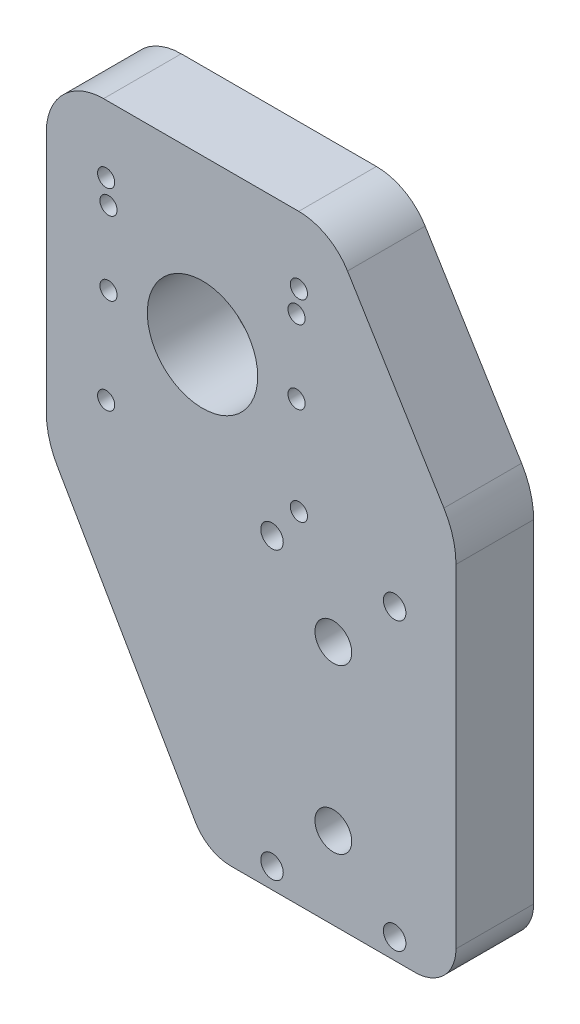
ISO-10303-21;
HEADER;
FILE_DESCRIPTION(('STEP AP214'),'2;1');
FILE_NAME('part.step','',(''),(''),'','','');
FILE_SCHEMA(('AUTOMOTIVE_DESIGN { 1 0 10303 214 1 1 1 1 }'));
ENDSEC;
DATA;
#1=APPLICATION_CONTEXT('core data for automotive mechanical design processes');
#2=APPLICATION_PROTOCOL_DEFINITION('international standard','automotive_design',2000,#1);
#3=PRODUCT_CONTEXT('',#1,'mechanical');
#4=PRODUCT('Part','Part','',(#3));
#5=PRODUCT_RELATED_PRODUCT_CATEGORY('part','',(#4));
#6=PRODUCT_DEFINITION_FORMATION('','',#4);
#7=PRODUCT_DEFINITION_CONTEXT('part definition',#1,'design');
#8=PRODUCT_DEFINITION('design','',#6,#7);
#9=PRODUCT_DEFINITION_SHAPE('','',#8);
#10=(LENGTH_UNIT() NAMED_UNIT(*) SI_UNIT(.MILLI.,.METRE.));
#11=(NAMED_UNIT(*) PLANE_ANGLE_UNIT() SI_UNIT($,.RADIAN.));
#12=(NAMED_UNIT(*) SI_UNIT($,.STERADIAN.) SOLID_ANGLE_UNIT());
#13=UNCERTAINTY_MEASURE_WITH_UNIT(LENGTH_MEASURE(1.E-05),#10,'distance_accuracy_value','');
#14=(GEOMETRIC_REPRESENTATION_CONTEXT(3) GLOBAL_UNCERTAINTY_ASSIGNED_CONTEXT((#13)) GLOBAL_UNIT_ASSIGNED_CONTEXT((#10,
#11,#12)) REPRESENTATION_CONTEXT('',''));
#15=CARTESIAN_POINT('',(0.,0.,0.));
#16=DIRECTION('',(0.,0.,1.));
#17=DIRECTION('',(1.,0.,0.));
#18=AXIS2_PLACEMENT_3D('',#15,#16,#17);
#19=CARTESIAN_POINT('',(-92.9999999999341,473.,0.));
#20=DIRECTION('',(0.,0.,-1.));
#21=DIRECTION('',(-1.,0.,0.));
#22=AXIS2_PLACEMENT_3D('',#19,#20,#21);
#23=PLANE('',#22);
#24=CARTESIAN_POINT('',(-109.999999999934,490.,0.));
#25=DIRECTION('',(0.,0.,-1.));
#26=DIRECTION('',(-1.,0.,0.));
#27=AXIS2_PLACEMENT_3D('',#24,#25,#26);
#28=CIRCLE('',#27,4.5);
#29=CARTESIAN_POINT('',(-114.499999999934,490.,0.));
#30=VERTEX_POINT('',#29);
#31=EDGE_CURVE('E559',#30,#30,#28,.T.);
#32=ORIENTED_EDGE('',*,*,#31,.F.);
#33=EDGE_LOOP('',(#32));
#34=FACE_BOUND('',#33,.T.);
#35=CARTESIAN_POINT('',(-109.999999999934,530.,0.));
#36=DIRECTION('',(0.,0.,-1.));
#37=DIRECTION('',(-1.,0.,0.));
#38=AXIS2_PLACEMENT_3D('',#35,#36,#37);
#39=CIRCLE('',#38,4.5);
#40=CARTESIAN_POINT('',(-114.499999999934,530.,0.));
#41=VERTEX_POINT('',#40);
#42=EDGE_CURVE('E171',#41,#41,#39,.T.);
#43=ORIENTED_EDGE('',*,*,#42,.F.);
#44=EDGE_LOOP('',(#43));
#45=FACE_BOUND('',#44,.T.);
#46=CARTESIAN_POINT('',(-89.9999999999341,480.,0.));
#47=DIRECTION('',(0.,0.,-1.));
#48=DIRECTION('',(-1.,0.,0.));
#49=AXIS2_PLACEMENT_3D('',#46,#47,#48);
#50=CIRCLE('',#49,9.99999999999997);
#51=CARTESIAN_POINT('',(-89.9999999999342,470.,0.));
#52=VERTEX_POINT('',#51);
#53=CARTESIAN_POINT('',(-79.9999999999341,480.,0.));
#54=VERTEX_POINT('',#53);
#55=EDGE_CURVE('E152',#52,#54,#50,.F.);
#56=ORIENTED_EDGE('',*,*,#55,.F.);
#57=DIRECTION('',(1.,0.,0.));
#58=VECTOR('',#57,1.);
#59=CARTESIAN_POINT('',(-129.30940107669,470.000000000001,0.));
#60=LINE('',#59,#58);
#61=CARTESIAN_POINT('',(-135.082903768587,470.000000000001,0.));
#62=VERTEX_POINT('',#61);
#63=EDGE_CURVE('E60',#62,#52,#60,.T.);
#64=ORIENTED_EDGE('',*,*,#63,.F.);
#65=CARTESIAN_POINT('',(-135.082903768587,480.000000000001,0.));
#66=DIRECTION('',(0.,0.,-1.));
#67=DIRECTION('',(-1.,0.,0.));
#68=AXIS2_PLACEMENT_3D('',#65,#66,#67);
#69=CIRCLE('',#68,10.);
#70=CARTESIAN_POINT('',(-143.743157806431,475.000000000001,0.));
#71=VERTEX_POINT('',#70);
#72=EDGE_CURVE('E178',#71,#62,#69,.F.);
#73=ORIENTED_EDGE('',*,*,#72,.F.);
#74=DIRECTION('',(0.5,-0.866025403784439,0.));
#75=VECTOR('',#74,1.);
#76=CARTESIAN_POINT('',(97.8736650439813,56.5073868597179,0.));
#77=LINE('',#76,#75);
#78=CARTESIAN_POINT('',(-177.520508076391,533.504086812621,0.));
#79=VERTEX_POINT('',#78);
#80=EDGE_CURVE('E184',#79,#71,#77,.T.);
#81=ORIENTED_EDGE('',*,*,#80,.F.);
#82=CARTESIAN_POINT('',(-160.200000000702,543.504086812621,0.));
#83=DIRECTION('',(0.,0.,-1.));
#84=DIRECTION('',(-1.,0.,0.));
#85=AXIS2_PLACEMENT_3D('',#82,#83,#84);
#86=CIRCLE('',#85,20.);
#87=CARTESIAN_POINT('',(-180.200000000702,543.504086812621,0.));
#88=VERTEX_POINT('',#87);
#89=EDGE_CURVE('E189',#88,#79,#86,.F.);
#90=ORIENTED_EDGE('',*,*,#89,.F.);
#91=DIRECTION('',(0.,-1.,0.));
#92=VECTOR('',#91,1.);
#93=CARTESIAN_POINT('',(-180.200000000702,0.,0.));
#94=LINE('',#93,#92);
#95=CARTESIAN_POINT('',(-180.200000000702,602.999999999993,0.));
#96=VERTEX_POINT('',#95);
#97=EDGE_CURVE('E194',#96,#88,#94,.T.);
#98=ORIENTED_EDGE('',*,*,#97,.F.);
#99=CARTESIAN_POINT('',(-166.200000000702,602.999999999993,0.));
#100=DIRECTION('',(0.,0.,-1.));
#101=DIRECTION('',(-1.,0.,0.));
#102=AXIS2_PLACEMENT_3D('',#99,#100,#101);
#103=CIRCLE('',#102,14.);
#104=CARTESIAN_POINT('',(-166.200000000702,616.999999999993,0.));
#105=VERTEX_POINT('',#104);
#106=EDGE_CURVE('E199',#105,#96,#103,.F.);
#107=ORIENTED_EDGE('',*,*,#106,.F.);
#108=DIRECTION('',(-1.,0.,0.));
#109=VECTOR('',#108,1.);
#110=CARTESIAN_POINT('',(0.,616.999999999993,0.));
#111=LINE('',#110,#109);
#112=CARTESIAN_POINT('',(-118.464037729129,616.999999999993,0.));
#113=VERTEX_POINT('',#112);
#114=EDGE_CURVE('E204',#113,#105,#111,.T.);
#115=ORIENTED_EDGE('',*,*,#114,.F.);
#116=CARTESIAN_POINT('',(-118.464037729129,602.999999999993,0.));
#117=DIRECTION('',(0.,0.,-1.));
#118=DIRECTION('',(-1.,0.,0.));
#119=AXIS2_PLACEMENT_3D('',#116,#117,#118);
#120=CIRCLE('',#119,14.);
#121=CARTESIAN_POINT('',(-106.530973280695,610.321336822563,0.));
#122=VERTEX_POINT('',#121);
#123=EDGE_CURVE('E209',#122,#113,#120,.F.);
#124=ORIENTED_EDGE('',*,*,#123,.F.);
#125=DIRECTION('',(-0.522952630183533,0.852361746316741,0.));
#126=VECTOR('',#125,1.);
#127=CARTESIAN_POINT('',(194.650631720716,119.424716401348,0.));
#128=LINE('',#127,#126);
#129=CARTESIAN_POINT('',(-82.9527650735984,571.891158709934,0.));
#130=VERTEX_POINT('',#129);
#131=EDGE_CURVE('E214',#130,#122,#128,.T.);
#132=ORIENTED_EDGE('',*,*,#131,.F.);
#133=CARTESIAN_POINT('',(-99.9999999999332,561.432106106264,0.));
#134=DIRECTION('',(0.,0.,-1.));
#135=DIRECTION('',(-1.,0.,0.));
#136=AXIS2_PLACEMENT_3D('',#133,#134,#135);
#137=CIRCLE('',#136,20.);
#138=CARTESIAN_POINT('',(-79.9999999999333,561.432106106264,0.));
#139=VERTEX_POINT('',#138);
#140=EDGE_CURVE('E107',#139,#130,#137,.F.);
#141=ORIENTED_EDGE('',*,*,#140,.F.);
#142=DIRECTION('',(0.,1.,0.));
#143=VECTOR('',#142,1.);
#144=CARTESIAN_POINT('',(-79.9999999999389,8.04389835716115E-13,0.));
#145=LINE('',#144,#143);
#146=EDGE_CURVE('E112',#54,#139,#145,.T.);
#147=ORIENTED_EDGE('',*,*,#146,.F.);
#148=EDGE_LOOP('',(#56,#64,#73,#81,#90,#98,#107,#115,#124,#132,#141,#147));
#149=FACE_BOUND('',#148,.T.);
#150=CARTESIAN_POINT('',(-124.999999999934,475.,0.));
#151=DIRECTION('',(0.,0.,1.));
#152=DIRECTION('',(1.,0.,0.));
#153=AXIS2_PLACEMENT_3D('',#150,#151,#152);
#154=CIRCLE('',#153,2.74999999999999);
#155=CARTESIAN_POINT('',(-122.249999999934,475.,0.));
#156=VERTEX_POINT('',#155);
#157=EDGE_CURVE('E446',#156,#156,#154,.T.);
#158=ORIENTED_EDGE('',*,*,#157,.T.);
#159=EDGE_LOOP('',(#158));
#160=FACE_BOUND('',#159,.T.);
#161=CARTESIAN_POINT('',(-94.999999999934,475.,0.));
#162=DIRECTION('',(0.,0.,1.));
#163=DIRECTION('',(1.,0.,0.));
#164=AXIS2_PLACEMENT_3D('',#161,#162,#163);
#165=CIRCLE('',#164,2.74999999999999);
#166=CARTESIAN_POINT('',(-92.249999999934,475.,0.));
#167=VERTEX_POINT('',#166);
#168=EDGE_CURVE('E450',#167,#167,#165,.T.);
#169=ORIENTED_EDGE('',*,*,#168,.T.);
#170=EDGE_LOOP('',(#169));
#171=FACE_BOUND('',#170,.T.);
#172=CARTESIAN_POINT('',(-119.00000000079,595.000000000025,0.));
#173=DIRECTION('',(0.,0.,-1.));
#174=DIRECTION('',(-1.,0.,0.));
#175=AXIS2_PLACEMENT_3D('',#172,#173,#174);
#176=CIRCLE('',#175,2.1);
#177=CARTESIAN_POINT('',(-121.10000000079,595.000000000025,0.));
#178=VERTEX_POINT('',#177);
#179=EDGE_CURVE('E454',#178,#178,#176,.T.);
#180=ORIENTED_EDGE('',*,*,#179,.F.);
#181=EDGE_LOOP('',(#180));
#182=FACE_BOUND('',#181,.T.);
#183=CARTESIAN_POINT('',(-119.00000000079,577.000000000025,0.));
#184=DIRECTION('',(0.,0.,-1.));
#185=DIRECTION('',(-1.,0.,0.));
#186=AXIS2_PLACEMENT_3D('',#183,#184,#185);
#187=CIRCLE('',#186,2.1);
#188=CARTESIAN_POINT('',(-121.10000000079,577.000000000025,0.));
#189=VERTEX_POINT('',#188);
#190=EDGE_CURVE('E458',#189,#189,#187,.T.);
#191=ORIENTED_EDGE('',*,*,#190,.F.);
#192=EDGE_LOOP('',(#191));
#193=FACE_BOUND('',#192,.T.);
#194=CARTESIAN_POINT('',(-165.00000000079,577.000000000025,0.));
#195=DIRECTION('',(0.,0.,-1.));
#196=DIRECTION('',(-1.,0.,0.));
#197=AXIS2_PLACEMENT_3D('',#194,#195,#196);
#198=CIRCLE('',#197,2.09999999999999);
#199=CARTESIAN_POINT('',(-167.10000000079,577.000000000025,0.));
#200=VERTEX_POINT('',#199);
#201=EDGE_CURVE('E462',#200,#200,#198,.T.);
#202=ORIENTED_EDGE('',*,*,#201,.F.);
#203=EDGE_LOOP('',(#202));
#204=FACE_BOUND('',#203,.T.);
#205=CARTESIAN_POINT('',(-165.00000000079,595.000000000025,0.));
#206=DIRECTION('',(0.,0.,-1.));
#207=DIRECTION('',(-1.,0.,0.));
#208=AXIS2_PLACEMENT_3D('',#205,#206,#207);
#209=CIRCLE('',#208,2.09999999999999);
#210=CARTESIAN_POINT('',(-167.10000000079,595.000000000025,0.));
#211=VERTEX_POINT('',#210);
#212=EDGE_CURVE('E466',#211,#211,#209,.T.);
#213=ORIENTED_EDGE('',*,*,#212,.F.);
#214=EDGE_LOOP('',(#213));
#215=FACE_BOUND('',#214,.T.);
#216=CARTESIAN_POINT('',(-142.000000000788,577.00000000002,0.));
#217=DIRECTION('',(0.,0.,-1.));
#218=DIRECTION('',(-1.,0.,0.));
#219=AXIS2_PLACEMENT_3D('',#216,#217,#218);
#220=CIRCLE('',#219,13.5);
#221=CARTESIAN_POINT('',(-155.500000000788,577.00000000002,0.));
#222=VERTEX_POINT('',#221);
#223=EDGE_CURVE('E53',#222,#222,#220,.T.);
#224=ORIENTED_EDGE('',*,*,#223,.F.);
#225=EDGE_LOOP('',(#224));
#226=FACE_BOUND('',#225,.T.);
#227=CARTESIAN_POINT('',(-124.999999999934,544.999999999999,0.));
#228=DIRECTION('',(0.,0.,1.));
#229=DIRECTION('',(1.,0.,0.));
#230=AXIS2_PLACEMENT_3D('',#227,#228,#229);
#231=CIRCLE('',#230,2.74999999999999);
#232=CARTESIAN_POINT('',(-122.249999999934,544.999999999999,0.));
#233=VERTEX_POINT('',#232);
#234=EDGE_CURVE('E363',#233,#233,#231,.T.);
#235=ORIENTED_EDGE('',*,*,#234,.T.);
#236=EDGE_LOOP('',(#235));
#237=FACE_BOUND('',#236,.T.);
#238=CARTESIAN_POINT('',(-94.999999999934,544.999999999999,0.));
#239=DIRECTION('',(0.,0.,1.));
#240=DIRECTION('',(1.,0.,0.));
#241=AXIS2_PLACEMENT_3D('',#238,#239,#240);
#242=CIRCLE('',#241,2.74999999999999);
#243=CARTESIAN_POINT('',(-92.249999999934,544.999999999999,0.));
#244=VERTEX_POINT('',#243);
#245=EDGE_CURVE('E352',#244,#244,#242,.T.);
#246=ORIENTED_EDGE('',*,*,#245,.T.);
#247=EDGE_LOOP('',(#246));
#248=FACE_BOUND('',#247,.T.);
#249=CARTESIAN_POINT('',(-118.430000000788,600.57000000002,0.));
#250=DIRECTION('',(0.,0.,1.));
#251=DIRECTION('',(1.,0.,0.));
#252=AXIS2_PLACEMENT_3D('',#249,#250,#251);
#253=CIRCLE('',#252,2.09999999999999);
#254=CARTESIAN_POINT('',(-116.330000000788,600.57000000002,0.));
#255=VERTEX_POINT('',#254);
#256=EDGE_CURVE('E279',#255,#255,#253,.T.);
#257=ORIENTED_EDGE('',*,*,#256,.T.);
#258=EDGE_LOOP('',(#257));
#259=FACE_BOUND('',#258,.T.);
#260=CARTESIAN_POINT('',(-118.430000000788,553.43000000002,0.));
#261=DIRECTION('',(0.,0.,1.));
#262=DIRECTION('',(1.,0.,0.));
#263=AXIS2_PLACEMENT_3D('',#260,#261,#262);
#264=CIRCLE('',#263,2.09999999999999);
#265=CARTESIAN_POINT('',(-116.330000000788,553.43000000002,0.));
#266=VERTEX_POINT('',#265);
#267=EDGE_CURVE('E269',#266,#266,#264,.T.);
#268=ORIENTED_EDGE('',*,*,#267,.T.);
#269=EDGE_LOOP('',(#268));
#270=FACE_BOUND('',#269,.T.);
#271=CARTESIAN_POINT('',(-165.570000000788,600.57000000002,0.));
#272=DIRECTION('',(0.,0.,1.));
#273=DIRECTION('',(1.,0.,0.));
#274=AXIS2_PLACEMENT_3D('',#271,#272,#273);
#275=CIRCLE('',#274,2.09999999999999);
#276=CARTESIAN_POINT('',(-163.470000000788,600.57000000002,0.));
#277=VERTEX_POINT('',#276);
#278=EDGE_CURVE('E270',#277,#277,#275,.T.);
#279=ORIENTED_EDGE('',*,*,#278,.T.);
#280=EDGE_LOOP('',(#279));
#281=FACE_BOUND('',#280,.T.);
#282=CARTESIAN_POINT('',(-165.570000000788,553.43000000002,0.));
#283=DIRECTION('',(0.,0.,1.));
#284=DIRECTION('',(1.,0.,0.));
#285=AXIS2_PLACEMENT_3D('',#282,#283,#284);
#286=CIRCLE('',#285,2.09999999999999);
#287=CARTESIAN_POINT('',(-163.470000000788,553.43000000002,0.));
#288=VERTEX_POINT('',#287);
#289=EDGE_CURVE('E252',#288,#288,#286,.T.);
#290=ORIENTED_EDGE('',*,*,#289,.T.);
#291=EDGE_LOOP('',(#290));
#292=FACE_BOUND('',#291,.T.);
#293=ADVANCED_FACE('F49',(#34,#45,#149,#160,#171,#182,#193,#204,#215,#226,#237,#248,#259,#270,
#281,#292),#23,.T.);
#294=CARTESIAN_POINT('',(-92.9999999999341,473.,19.));
#295=DIRECTION('',(0.,0.,-1.));
#296=DIRECTION('',(-1.,0.,0.));
#297=AXIS2_PLACEMENT_3D('',#294,#295,#296);
#298=PLANE('',#297);
#299=CARTESIAN_POINT('',(-109.999999999934,490.,19.));
#300=DIRECTION('',(0.,0.,-1.));
#301=DIRECTION('',(-1.,0.,0.));
#302=AXIS2_PLACEMENT_3D('',#299,#300,#301);
#303=CIRCLE('',#302,4.49999999999999);
#304=CARTESIAN_POINT('',(-114.499999999934,490.,19.));
#305=VERTEX_POINT('',#304);
#306=EDGE_CURVE('E556',#305,#305,#303,.T.);
#307=ORIENTED_EDGE('',*,*,#306,.T.);
#308=EDGE_LOOP('',(#307));
#309=FACE_BOUND('',#308,.T.);
#310=CARTESIAN_POINT('',(-109.999999999934,530.,19.));
#311=DIRECTION('',(0.,0.,-1.));
#312=DIRECTION('',(-1.,0.,0.));
#313=AXIS2_PLACEMENT_3D('',#310,#311,#312);
#314=CIRCLE('',#313,4.49999999999999);
#315=CARTESIAN_POINT('',(-114.499999999934,530.,19.));
#316=VERTEX_POINT('',#315);
#317=EDGE_CURVE('E165',#316,#316,#314,.T.);
#318=ORIENTED_EDGE('',*,*,#317,.T.);
#319=EDGE_LOOP('',(#318));
#320=FACE_BOUND('',#319,.T.);
#321=CARTESIAN_POINT('',(-135.082903768587,480.000000000001,19.));
#322=DIRECTION('',(0.,0.,1.));
#323=DIRECTION('',(1.,0.,0.));
#324=AXIS2_PLACEMENT_3D('',#321,#322,#323);
#325=CIRCLE('',#324,10.);
#326=CARTESIAN_POINT('',(-143.743157806431,475.000000000001,19.));
#327=VERTEX_POINT('',#326);
#328=CARTESIAN_POINT('',(-135.082903768587,470.000000000001,19.));
#329=VERTEX_POINT('',#328);
#330=EDGE_CURVE('E177',#327,#329,#325,.T.);
#331=ORIENTED_EDGE('',*,*,#330,.T.);
#332=DIRECTION('',(1.,0.,0.));
#333=VECTOR('',#332,1.);
#334=CARTESIAN_POINT('',(-129.30940107669,470.000000000001,19.));
#335=LINE('',#334,#333);
#336=CARTESIAN_POINT('',(-89.9999999999342,470.,19.));
#337=VERTEX_POINT('',#336);
#338=EDGE_CURVE('E12',#329,#337,#335,.T.);
#339=ORIENTED_EDGE('',*,*,#338,.T.);
#340=CARTESIAN_POINT('',(-89.9999999999341,480.,19.));
#341=DIRECTION('',(0.,0.,1.));
#342=DIRECTION('',(1.,0.,0.));
#343=AXIS2_PLACEMENT_3D('',#340,#341,#342);
#344=CIRCLE('',#343,9.99999999999997);
#345=CARTESIAN_POINT('',(-79.9999999999341,480.,19.));
#346=VERTEX_POINT('',#345);
#347=EDGE_CURVE('E151',#337,#346,#344,.T.);
#348=ORIENTED_EDGE('',*,*,#347,.T.);
#349=DIRECTION('',(0.,1.,0.));
#350=VECTOR('',#349,1.);
#351=CARTESIAN_POINT('',(-79.9999999999389,8.04389835716115E-13,19.));
#352=LINE('',#351,#350);
#353=CARTESIAN_POINT('',(-79.9999999999333,561.432106106264,19.));
#354=VERTEX_POINT('',#353);
#355=EDGE_CURVE('E156',#346,#354,#352,.T.);
#356=ORIENTED_EDGE('',*,*,#355,.T.);
#357=CARTESIAN_POINT('',(-99.9999999999332,561.432106106264,19.));
#358=DIRECTION('',(0.,0.,1.));
#359=DIRECTION('',(1.,0.,0.));
#360=AXIS2_PLACEMENT_3D('',#357,#358,#359);
#361=CIRCLE('',#360,20.);
#362=CARTESIAN_POINT('',(-82.9527650735983,571.891158709934,19.));
#363=VERTEX_POINT('',#362);
#364=EDGE_CURVE('E160',#354,#363,#361,.T.);
#365=ORIENTED_EDGE('',*,*,#364,.T.);
#366=DIRECTION('',(-0.522952630183533,0.852361746316741,0.));
#367=VECTOR('',#366,1.);
#368=CARTESIAN_POINT('',(194.650631720716,119.424716401348,19.));
#369=LINE('',#368,#367);
#370=CARTESIAN_POINT('',(-106.530973280695,610.321336822563,19.));
#371=VERTEX_POINT('',#370);
#372=EDGE_CURVE('E398',#363,#371,#369,.T.);
#373=ORIENTED_EDGE('',*,*,#372,.T.);
#374=CARTESIAN_POINT('',(-118.464037729129,602.999999999993,19.));
#375=DIRECTION('',(0.,0.,1.));
#376=DIRECTION('',(1.,0.,0.));
#377=AXIS2_PLACEMENT_3D('',#374,#375,#376);
#378=CIRCLE('',#377,14.);
#379=CARTESIAN_POINT('',(-118.464037729129,616.999999999993,19.));
#380=VERTEX_POINT('',#379);
#381=EDGE_CURVE('E394',#371,#380,#378,.T.);
#382=ORIENTED_EDGE('',*,*,#381,.T.);
#383=DIRECTION('',(-1.,0.,0.));
#384=VECTOR('',#383,1.);
#385=CARTESIAN_POINT('',(0.,616.999999999993,19.));
#386=LINE('',#385,#384);
#387=CARTESIAN_POINT('',(-166.200000000702,616.999999999993,19.));
#388=VERTEX_POINT('',#387);
#389=EDGE_CURVE('E390',#380,#388,#386,.T.);
#390=ORIENTED_EDGE('',*,*,#389,.T.);
#391=CARTESIAN_POINT('',(-166.200000000702,602.999999999993,19.));
#392=DIRECTION('',(0.,0.,1.));
#393=DIRECTION('',(1.,0.,0.));
#394=AXIS2_PLACEMENT_3D('',#391,#392,#393);
#395=CIRCLE('',#394,14.);
#396=CARTESIAN_POINT('',(-180.200000000702,602.999999999993,19.));
#397=VERTEX_POINT('',#396);
#398=EDGE_CURVE('E386',#388,#397,#395,.T.);
#399=ORIENTED_EDGE('',*,*,#398,.T.);
#400=DIRECTION('',(0.,-1.,0.));
#401=VECTOR('',#400,1.);
#402=CARTESIAN_POINT('',(-180.200000000702,0.,19.));
#403=LINE('',#402,#401);
#404=CARTESIAN_POINT('',(-180.200000000702,543.504086812621,19.));
#405=VERTEX_POINT('',#404);
#406=EDGE_CURVE('E382',#397,#405,#403,.T.);
#407=ORIENTED_EDGE('',*,*,#406,.T.);
#408=CARTESIAN_POINT('',(-160.200000000702,543.504086812621,19.));
#409=DIRECTION('',(0.,0.,1.));
#410=DIRECTION('',(1.,0.,0.));
#411=AXIS2_PLACEMENT_3D('',#408,#409,#410);
#412=CIRCLE('',#411,20.);
#413=CARTESIAN_POINT('',(-177.520508076391,533.504086812621,19.));
#414=VERTEX_POINT('',#413);
#415=EDGE_CURVE('E378',#405,#414,#412,.T.);
#416=ORIENTED_EDGE('',*,*,#415,.T.);
#417=DIRECTION('',(0.5,-0.866025403784438,0.));
#418=VECTOR('',#417,1.);
#419=CARTESIAN_POINT('',(97.8736650439813,56.5073868597179,19.));
#420=LINE('',#419,#418);
#421=EDGE_CURVE('E374',#414,#327,#420,.T.);
#422=ORIENTED_EDGE('',*,*,#421,.T.);
#423=EDGE_LOOP('',(#331,#339,#348,#356,#365,#373,#382,#390,#399,#407,#416,#422));
#424=FACE_BOUND('',#423,.T.);
#425=CARTESIAN_POINT('',(-165.570000000788,553.43000000002,19.));
#426=DIRECTION('',(0.,0.,1.));
#427=DIRECTION('',(1.,0.,0.));
#428=AXIS2_PLACEMENT_3D('',#425,#426,#427);
#429=CIRCLE('',#428,2.09999999999999);
#430=CARTESIAN_POINT('',(-163.470000000788,553.43000000002,19.));
#431=VERTEX_POINT('',#430);
#432=EDGE_CURVE('E247',#431,#431,#429,.T.);
#433=ORIENTED_EDGE('',*,*,#432,.F.);
#434=EDGE_LOOP('',(#433));
#435=FACE_BOUND('',#434,.T.);
#436=CARTESIAN_POINT('',(-165.570000000788,600.57000000002,19.));
#437=DIRECTION('',(0.,0.,1.));
#438=DIRECTION('',(1.,0.,0.));
#439=AXIS2_PLACEMENT_3D('',#436,#437,#438);
#440=CIRCLE('',#439,2.09999999999999);
#441=CARTESIAN_POINT('',(-163.470000000788,600.57000000002,19.));
#442=VERTEX_POINT('',#441);
#443=EDGE_CURVE('E285',#442,#442,#440,.T.);
#444=ORIENTED_EDGE('',*,*,#443,.F.);
#445=EDGE_LOOP('',(#444));
#446=FACE_BOUND('',#445,.T.);
#447=CARTESIAN_POINT('',(-118.430000000788,553.43000000002,19.));
#448=DIRECTION('',(0.,0.,1.));
#449=DIRECTION('',(1.,0.,0.));
#450=AXIS2_PLACEMENT_3D('',#447,#448,#449);
#451=CIRCLE('',#450,2.1);
#452=CARTESIAN_POINT('',(-116.330000000788,553.43000000002,19.));
#453=VERTEX_POINT('',#452);
#454=EDGE_CURVE('E263',#453,#453,#451,.T.);
#455=ORIENTED_EDGE('',*,*,#454,.F.);
#456=EDGE_LOOP('',(#455));
#457=FACE_BOUND('',#456,.T.);
#458=CARTESIAN_POINT('',(-118.430000000788,600.57000000002,19.));
#459=DIRECTION('',(0.,0.,1.));
#460=DIRECTION('',(1.,0.,0.));
#461=AXIS2_PLACEMENT_3D('',#458,#459,#460);
#462=CIRCLE('',#461,2.1);
#463=CARTESIAN_POINT('',(-116.330000000788,600.57000000002,19.));
#464=VERTEX_POINT('',#463);
#465=EDGE_CURVE('E274',#464,#464,#462,.T.);
#466=ORIENTED_EDGE('',*,*,#465,.F.);
#467=EDGE_LOOP('',(#466));
#468=FACE_BOUND('',#467,.T.);
#469=CARTESIAN_POINT('',(-124.999999999934,544.999999999999,19.));
#470=DIRECTION('',(0.,0.,1.));
#471=DIRECTION('',(1.,0.,0.));
#472=AXIS2_PLACEMENT_3D('',#469,#470,#471);
#473=CIRCLE('',#472,2.75);
#474=CARTESIAN_POINT('',(-122.249999999934,544.999999999999,19.));
#475=VERTEX_POINT('',#474);
#476=EDGE_CURVE('E318',#475,#475,#473,.T.);
#477=ORIENTED_EDGE('',*,*,#476,.F.);
#478=EDGE_LOOP('',(#477));
#479=FACE_BOUND('',#478,.T.);
#480=CARTESIAN_POINT('',(-94.999999999934,475.,19.));
#481=DIRECTION('',(0.,0.,1.));
#482=DIRECTION('',(1.,0.,0.));
#483=AXIS2_PLACEMENT_3D('',#480,#481,#482);
#484=CIRCLE('',#483,2.75);
#485=CARTESIAN_POINT('',(-92.249999999934,475.,19.));
#486=VERTEX_POINT('',#485);
#487=EDGE_CURVE('E322',#486,#486,#484,.T.);
#488=ORIENTED_EDGE('',*,*,#487,.F.);
#489=EDGE_LOOP('',(#488));
#490=FACE_BOUND('',#489,.T.);
#491=CARTESIAN_POINT('',(-119.00000000079,595.000000000025,19.));
#492=DIRECTION('',(0.,0.,-1.));
#493=DIRECTION('',(-1.,0.,0.));
#494=AXIS2_PLACEMENT_3D('',#491,#492,#493);
#495=CIRCLE('',#494,2.09999999999999);
#496=CARTESIAN_POINT('',(-121.10000000079,595.000000000025,19.));
#497=VERTEX_POINT('',#496);
#498=EDGE_CURVE('E326',#497,#497,#495,.T.);
#499=ORIENTED_EDGE('',*,*,#498,.T.);
#500=EDGE_LOOP('',(#499));
#501=FACE_BOUND('',#500,.T.);
#502=CARTESIAN_POINT('',(-119.00000000079,577.000000000025,19.));
#503=DIRECTION('',(0.,0.,-1.));
#504=DIRECTION('',(-1.,0.,0.));
#505=AXIS2_PLACEMENT_3D('',#502,#503,#504);
#506=CIRCLE('',#505,2.09999999999999);
#507=CARTESIAN_POINT('',(-121.10000000079,577.000000000025,19.));
#508=VERTEX_POINT('',#507);
#509=EDGE_CURVE('E330',#508,#508,#506,.T.);
#510=ORIENTED_EDGE('',*,*,#509,.T.);
#511=EDGE_LOOP('',(#510));
#512=FACE_BOUND('',#511,.T.);
#513=CARTESIAN_POINT('',(-165.00000000079,577.000000000025,19.));
#514=DIRECTION('',(0.,0.,-1.));
#515=DIRECTION('',(-1.,0.,0.));
#516=AXIS2_PLACEMENT_3D('',#513,#514,#515);
#517=CIRCLE('',#516,2.09999999999999);
#518=CARTESIAN_POINT('',(-167.10000000079,577.000000000025,19.));
#519=VERTEX_POINT('',#518);
#520=EDGE_CURVE('E334',#519,#519,#517,.T.);
#521=ORIENTED_EDGE('',*,*,#520,.T.);
#522=EDGE_LOOP('',(#521));
#523=FACE_BOUND('',#522,.T.);
#524=CARTESIAN_POINT('',(-165.00000000079,595.000000000025,19.));
#525=DIRECTION('',(0.,0.,-1.));
#526=DIRECTION('',(-1.,0.,0.));
#527=AXIS2_PLACEMENT_3D('',#524,#525,#526);
#528=CIRCLE('',#527,2.09999999999999);
#529=CARTESIAN_POINT('',(-167.10000000079,595.000000000025,19.));
#530=VERTEX_POINT('',#529);
#531=EDGE_CURVE('E338',#530,#530,#528,.T.);
#532=ORIENTED_EDGE('',*,*,#531,.T.);
#533=EDGE_LOOP('',(#532));
#534=FACE_BOUND('',#533,.T.);
#535=CARTESIAN_POINT('',(-142.000000000788,577.00000000002,19.));
#536=DIRECTION('',(0.,0.,1.));
#537=DIRECTION('',(1.,0.,0.));
#538=AXIS2_PLACEMENT_3D('',#535,#536,#537);
#539=CIRCLE('',#538,13.5);
#540=CARTESIAN_POINT('',(-128.500000000788,577.00000000002,19.));
#541=VERTEX_POINT('',#540);
#542=EDGE_CURVE('E342',#541,#541,#539,.T.);
#543=ORIENTED_EDGE('',*,*,#542,.F.);
#544=EDGE_LOOP('',(#543));
#545=FACE_BOUND('',#544,.T.);
#546=CARTESIAN_POINT('',(-124.999999999934,475.,19.));
#547=DIRECTION('',(0.,0.,1.));
#548=DIRECTION('',(1.,0.,0.));
#549=AXIS2_PLACEMENT_3D('',#546,#547,#548);
#550=CIRCLE('',#549,2.75);
#551=CARTESIAN_POINT('',(-122.249999999934,475.,19.));
#552=VERTEX_POINT('',#551);
#553=EDGE_CURVE('E346',#552,#552,#550,.T.);
#554=ORIENTED_EDGE('',*,*,#553,.F.);
#555=EDGE_LOOP('',(#554));
#556=FACE_BOUND('',#555,.T.);
#557=CARTESIAN_POINT('',(-94.999999999934,544.999999999999,19.));
#558=DIRECTION('',(0.,0.,1.));
#559=DIRECTION('',(1.,0.,0.));
#560=AXIS2_PLACEMENT_3D('',#557,#558,#559);
#561=CIRCLE('',#560,2.75);
#562=CARTESIAN_POINT('',(-92.249999999934,544.999999999999,19.));
#563=VERTEX_POINT('',#562);
#564=EDGE_CURVE('E349',#563,#563,#561,.T.);
#565=ORIENTED_EDGE('',*,*,#564,.F.);
#566=EDGE_LOOP('',(#565));
#567=FACE_BOUND('',#566,.T.);
#568=ADVANCED_FACE('F162',(#309,#320,#424,#435,#446,#457,#468,#479,#490,#501,#512,#523,#534,
#545,#556,#567),#298,.F.);
#569=CARTESIAN_POINT('',(-129.30940107669,470.000000000001,19.));
#570=DIRECTION('',(0.,1.,0.));
#571=DIRECTION('',(-1.,0.,0.));
#572=AXIS2_PLACEMENT_3D('',#569,#570,#571);
#573=PLANE('',#572);
#574=ORIENTED_EDGE('',*,*,#338,.F.);
#575=DIRECTION('',(0.,0.,1.));
#576=VECTOR('',#575,1.);
#577=CARTESIAN_POINT('',(-135.082903768587,470.000000000001,-177.901770649288));
#578=LINE('',#577,#576);
#579=EDGE_CURVE('E182',#62,#329,#578,.T.);
#580=ORIENTED_EDGE('',*,*,#579,.F.);
#581=ORIENTED_EDGE('',*,*,#63,.T.);
#582=DIRECTION('',(0.,0.,1.));
#583=VECTOR('',#582,1.);
#584=CARTESIAN_POINT('',(-89.9999999999342,470.,-177.901770649288));
#585=LINE('',#584,#583);
#586=EDGE_CURVE('E226',#52,#337,#585,.T.);
#587=ORIENTED_EDGE('',*,*,#586,.T.);
#588=EDGE_LOOP('',(#574,#580,#581,#587));
#589=FACE_BOUND('',#588,.T.);
#590=ADVANCED_FACE('F51',(#589),#573,.F.);
#591=CARTESIAN_POINT('',(-142.000000000788,577.00000000002,-1.));
#592=DIRECTION('',(0.,0.,1.));
#593=DIRECTION('',(1.,0.,0.));
#594=AXIS2_PLACEMENT_3D('',#591,#592,#593);
#595=CYLINDRICAL_SURFACE('',#594,13.5);
#596=ORIENTED_EDGE('',*,*,#223,.T.);
#597=EDGE_LOOP('',(#596));
#598=FACE_BOUND('',#597,.T.);
#599=ORIENTED_EDGE('',*,*,#542,.T.);
#600=EDGE_LOOP('',(#599));
#601=FACE_BOUND('',#600,.T.);
#602=ADVANCED_FACE('F526',(#598,#601),#595,.F.);
#603=CARTESIAN_POINT('',(-165.00000000079,595.000000000025,0.));
#604=DIRECTION('',(0.,0.,-1.));
#605=DIRECTION('',(-1.,0.,0.));
#606=AXIS2_PLACEMENT_3D('',#603,#604,#605);
#607=CYLINDRICAL_SURFACE('',#606,2.09999999999999);
#608=ORIENTED_EDGE('',*,*,#531,.F.);
#609=EDGE_LOOP('',(#608));
#610=FACE_BOUND('',#609,.T.);
#611=ORIENTED_EDGE('',*,*,#212,.T.);
#612=EDGE_LOOP('',(#611));
#613=FACE_BOUND('',#612,.T.);
#614=ADVANCED_FACE('F522',(#610,#613),#607,.F.);
#615=CARTESIAN_POINT('',(-165.00000000079,577.000000000025,0.));
#616=DIRECTION('',(0.,0.,-1.));
#617=DIRECTION('',(-1.,0.,0.));
#618=AXIS2_PLACEMENT_3D('',#615,#616,#617);
#619=CYLINDRICAL_SURFACE('',#618,2.09999999999999);
#620=ORIENTED_EDGE('',*,*,#520,.F.);
#621=EDGE_LOOP('',(#620));
#622=FACE_BOUND('',#621,.T.);
#623=ORIENTED_EDGE('',*,*,#201,.T.);
#624=EDGE_LOOP('',(#623));
#625=FACE_BOUND('',#624,.T.);
#626=ADVANCED_FACE('F518',(#622,#625),#619,.F.);
#627=CARTESIAN_POINT('',(-119.00000000079,577.000000000025,0.));
#628=DIRECTION('',(0.,0.,-1.));
#629=DIRECTION('',(-1.,0.,0.));
#630=AXIS2_PLACEMENT_3D('',#627,#628,#629);
#631=CYLINDRICAL_SURFACE('',#630,2.1);
#632=ORIENTED_EDGE('',*,*,#509,.F.);
#633=EDGE_LOOP('',(#632));
#634=FACE_BOUND('',#633,.T.);
#635=ORIENTED_EDGE('',*,*,#190,.T.);
#636=EDGE_LOOP('',(#635));
#637=FACE_BOUND('',#636,.T.);
#638=ADVANCED_FACE('F514',(#634,#637),#631,.F.);
#639=CARTESIAN_POINT('',(-119.00000000079,595.000000000025,0.));
#640=DIRECTION('',(0.,0.,-1.));
#641=DIRECTION('',(-1.,0.,0.));
#642=AXIS2_PLACEMENT_3D('',#639,#640,#641);
#643=CYLINDRICAL_SURFACE('',#642,2.1);
#644=ORIENTED_EDGE('',*,*,#498,.F.);
#645=EDGE_LOOP('',(#644));
#646=FACE_BOUND('',#645,.T.);
#647=ORIENTED_EDGE('',*,*,#179,.T.);
#648=EDGE_LOOP('',(#647));
#649=FACE_BOUND('',#648,.T.);
#650=ADVANCED_FACE('F510',(#646,#649),#643,.F.);
#651=CARTESIAN_POINT('',(-94.999999999934,475.,19.));
#652=DIRECTION('',(0.,0.,1.));
#653=DIRECTION('',(1.,0.,0.));
#654=AXIS2_PLACEMENT_3D('',#651,#652,#653);
#655=CYLINDRICAL_SURFACE('',#654,2.75);
#656=ORIENTED_EDGE('',*,*,#168,.F.);
#657=EDGE_LOOP('',(#656));
#658=FACE_BOUND('',#657,.T.);
#659=ORIENTED_EDGE('',*,*,#487,.T.);
#660=EDGE_LOOP('',(#659));
#661=FACE_BOUND('',#660,.T.);
#662=ADVANCED_FACE('F506',(#658,#661),#655,.F.);
#663=CARTESIAN_POINT('',(-124.999999999934,475.,19.));
#664=DIRECTION('',(0.,0.,1.));
#665=DIRECTION('',(1.,0.,0.));
#666=AXIS2_PLACEMENT_3D('',#663,#664,#665);
#667=CYLINDRICAL_SURFACE('',#666,2.75);
#668=ORIENTED_EDGE('',*,*,#157,.F.);
#669=EDGE_LOOP('',(#668));
#670=FACE_BOUND('',#669,.T.);
#671=ORIENTED_EDGE('',*,*,#553,.T.);
#672=EDGE_LOOP('',(#671));
#673=FACE_BOUND('',#672,.T.);
#674=ADVANCED_FACE('F502',(#670,#673),#667,.F.);
#675=CARTESIAN_POINT('',(-124.999999999934,544.999999999999,19.));
#676=DIRECTION('',(0.,0.,1.));
#677=DIRECTION('',(1.,0.,0.));
#678=AXIS2_PLACEMENT_3D('',#675,#676,#677);
#679=CYLINDRICAL_SURFACE('',#678,2.75);
#680=ORIENTED_EDGE('',*,*,#234,.F.);
#681=EDGE_LOOP('',(#680));
#682=FACE_BOUND('',#681,.T.);
#683=ORIENTED_EDGE('',*,*,#476,.T.);
#684=EDGE_LOOP('',(#683));
#685=FACE_BOUND('',#684,.T.);
#686=ADVANCED_FACE('F498',(#682,#685),#679,.F.);
#687=CARTESIAN_POINT('',(-94.999999999934,544.999999999999,19.));
#688=DIRECTION('',(0.,0.,1.));
#689=DIRECTION('',(1.,0.,0.));
#690=AXIS2_PLACEMENT_3D('',#687,#688,#689);
#691=CYLINDRICAL_SURFACE('',#690,2.75);
#692=ORIENTED_EDGE('',*,*,#245,.F.);
#693=EDGE_LOOP('',(#692));
#694=FACE_BOUND('',#693,.T.);
#695=ORIENTED_EDGE('',*,*,#564,.T.);
#696=EDGE_LOOP('',(#695));
#697=FACE_BOUND('',#696,.T.);
#698=ADVANCED_FACE('F494',(#694,#697),#691,.F.);
#699=CARTESIAN_POINT('',(-118.430000000788,600.57000000002,19.));
#700=DIRECTION('',(0.,0.,1.));
#701=DIRECTION('',(1.,0.,0.));
#702=AXIS2_PLACEMENT_3D('',#699,#700,#701);
#703=CYLINDRICAL_SURFACE('',#702,2.1);
#704=ORIENTED_EDGE('',*,*,#256,.F.);
#705=EDGE_LOOP('',(#704));
#706=FACE_BOUND('',#705,.T.);
#707=ORIENTED_EDGE('',*,*,#465,.T.);
#708=EDGE_LOOP('',(#707));
#709=FACE_BOUND('',#708,.T.);
#710=ADVANCED_FACE('F487',(#706,#709),#703,.F.);
#711=CARTESIAN_POINT('',(-118.430000000788,553.43000000002,19.));
#712=DIRECTION('',(0.,0.,1.));
#713=DIRECTION('',(1.,0.,0.));
#714=AXIS2_PLACEMENT_3D('',#711,#712,#713);
#715=CYLINDRICAL_SURFACE('',#714,2.1);
#716=ORIENTED_EDGE('',*,*,#267,.F.);
#717=EDGE_LOOP('',(#716));
#718=FACE_BOUND('',#717,.T.);
#719=ORIENTED_EDGE('',*,*,#454,.T.);
#720=EDGE_LOOP('',(#719));
#721=FACE_BOUND('',#720,.T.);
#722=ADVANCED_FACE('F482',(#718,#721),#715,.F.);
#723=CARTESIAN_POINT('',(-165.570000000788,600.57000000002,19.));
#724=DIRECTION('',(0.,0.,1.));
#725=DIRECTION('',(1.,0.,0.));
#726=AXIS2_PLACEMENT_3D('',#723,#724,#725);
#727=CYLINDRICAL_SURFACE('',#726,2.09999999999999);
#728=ORIENTED_EDGE('',*,*,#278,.F.);
#729=EDGE_LOOP('',(#728));
#730=FACE_BOUND('',#729,.T.);
#731=ORIENTED_EDGE('',*,*,#443,.T.);
#732=EDGE_LOOP('',(#731));
#733=FACE_BOUND('',#732,.T.);
#734=ADVANCED_FACE('F303',(#730,#733),#727,.F.);
#735=CARTESIAN_POINT('',(-165.570000000788,553.43000000002,19.));
#736=DIRECTION('',(0.,0.,1.));
#737=DIRECTION('',(1.,0.,0.));
#738=AXIS2_PLACEMENT_3D('',#735,#736,#737);
#739=CYLINDRICAL_SURFACE('',#738,2.09999999999999);
#740=ORIENTED_EDGE('',*,*,#289,.F.);
#741=EDGE_LOOP('',(#740));
#742=FACE_BOUND('',#741,.T.);
#743=ORIENTED_EDGE('',*,*,#432,.T.);
#744=EDGE_LOOP('',(#743));
#745=FACE_BOUND('',#744,.T.);
#746=ADVANCED_FACE('F300',(#742,#745),#739,.F.);
#747=CARTESIAN_POINT('',(-89.9999999999341,480.,-177.901770649288));
#748=DIRECTION('',(0.,0.,1.));
#749=DIRECTION('',(1.,0.,0.));
#750=AXIS2_PLACEMENT_3D('',#747,#748,#749);
#751=CYLINDRICAL_SURFACE('',#750,9.99999999999997);
#752=ORIENTED_EDGE('',*,*,#586,.F.);
#753=ORIENTED_EDGE('',*,*,#55,.T.);
#754=DIRECTION('',(0.,0.,1.));
#755=VECTOR('',#754,1.);
#756=CARTESIAN_POINT('',(-79.9999999999341,480.,-177.901770649288));
#757=LINE('',#756,#755);
#758=EDGE_CURVE('E148',#54,#346,#757,.T.);
#759=ORIENTED_EDGE('',*,*,#758,.T.);
#760=ORIENTED_EDGE('',*,*,#347,.F.);
#761=EDGE_LOOP('',(#752,#753,#759,#760));
#762=FACE_BOUND('',#761,.T.);
#763=ADVANCED_FACE('F150',(#762),#751,.T.);
#764=CARTESIAN_POINT('',(-79.9999999999389,8.04389835716115E-13,-177.901770649288));
#765=DIRECTION('',(1.,0.,0.));
#766=DIRECTION('',(0.,1.,0.));
#767=AXIS2_PLACEMENT_3D('',#764,#765,#766);
#768=PLANE('',#767);
#769=ORIENTED_EDGE('',*,*,#758,.F.);
#770=ORIENTED_EDGE('',*,*,#146,.T.);
#771=DIRECTION('',(0.,0.,1.));
#772=VECTOR('',#771,1.);
#773=CARTESIAN_POINT('',(-79.9999999999333,561.432106106264,-177.901770649288));
#774=LINE('',#773,#772);
#775=EDGE_CURVE('E142',#139,#354,#774,.T.);
#776=ORIENTED_EDGE('',*,*,#775,.T.);
#777=ORIENTED_EDGE('',*,*,#355,.F.);
#778=EDGE_LOOP('',(#769,#770,#776,#777));
#779=FACE_BOUND('',#778,.T.);
#780=ADVANCED_FACE('F157',(#779),#768,.T.);
#781=CARTESIAN_POINT('',(-99.9999999999332,561.432106106264,-177.901770649288));
#782=DIRECTION('',(0.,0.,1.));
#783=DIRECTION('',(1.,0.,0.));
#784=AXIS2_PLACEMENT_3D('',#781,#782,#783);
#785=CYLINDRICAL_SURFACE('',#784,20.);
#786=ORIENTED_EDGE('',*,*,#775,.F.);
#787=ORIENTED_EDGE('',*,*,#140,.T.);
#788=DIRECTION('',(0.,0.,1.));
#789=VECTOR('',#788,1.);
#790=CARTESIAN_POINT('',(-82.9527650735983,571.891158709934,-177.901770649288));
#791=LINE('',#790,#789);
#792=EDGE_CURVE('E218',#130,#363,#791,.T.);
#793=ORIENTED_EDGE('',*,*,#792,.T.);
#794=ORIENTED_EDGE('',*,*,#364,.F.);
#795=EDGE_LOOP('',(#786,#787,#793,#794));
#796=FACE_BOUND('',#795,.T.);
#797=ADVANCED_FACE('F405',(#796),#785,.T.);
#798=CARTESIAN_POINT('',(194.650631720716,119.424716401348,-177.901770649288));
#799=DIRECTION('',(0.852361746316741,0.522952630183533,0.));
#800=DIRECTION('',(-0.522952630183533,0.852361746316741,0.));
#801=AXIS2_PLACEMENT_3D('',#798,#799,#800);
#802=PLANE('',#801);
#803=ORIENTED_EDGE('',*,*,#792,.F.);
#804=ORIENTED_EDGE('',*,*,#131,.T.);
#805=DIRECTION('',(0.,0.,1.));
#806=VECTOR('',#805,1.);
#807=CARTESIAN_POINT('',(-106.530973280695,610.321336822563,-177.901770649288));
#808=LINE('',#807,#806);
#809=EDGE_CURVE('E213',#122,#371,#808,.T.);
#810=ORIENTED_EDGE('',*,*,#809,.T.);
#811=ORIENTED_EDGE('',*,*,#372,.F.);
#812=EDGE_LOOP('',(#803,#804,#810,#811));
#813=FACE_BOUND('',#812,.T.);
#814=ADVANCED_FACE('F408',(#813),#802,.T.);
#815=CARTESIAN_POINT('',(-118.464037729129,602.999999999993,-177.901770649288));
#816=DIRECTION('',(0.,0.,1.));
#817=DIRECTION('',(1.,0.,0.));
#818=AXIS2_PLACEMENT_3D('',#815,#816,#817);
#819=CYLINDRICAL_SURFACE('',#818,14.);
#820=ORIENTED_EDGE('',*,*,#809,.F.);
#821=ORIENTED_EDGE('',*,*,#123,.T.);
#822=DIRECTION('',(0.,0.,1.));
#823=VECTOR('',#822,1.);
#824=CARTESIAN_POINT('',(-118.464037729129,616.999999999993,-177.901770649288));
#825=LINE('',#824,#823);
#826=EDGE_CURVE('E208',#113,#380,#825,.T.);
#827=ORIENTED_EDGE('',*,*,#826,.T.);
#828=ORIENTED_EDGE('',*,*,#381,.F.);
#829=EDGE_LOOP('',(#820,#821,#827,#828));
#830=FACE_BOUND('',#829,.T.);
#831=ADVANCED_FACE('F412',(#830),#819,.T.);
#832=CARTESIAN_POINT('',(0.,616.999999999993,-177.901770649288));
#833=DIRECTION('',(0.,1.,0.));
#834=DIRECTION('',(0.,0.,1.));
#835=AXIS2_PLACEMENT_3D('',#832,#833,#834);
#836=PLANE('',#835);
#837=ORIENTED_EDGE('',*,*,#826,.F.);
#838=ORIENTED_EDGE('',*,*,#114,.T.);
#839=DIRECTION('',(0.,0.,1.));
#840=VECTOR('',#839,1.);
#841=CARTESIAN_POINT('',(-166.200000000702,616.999999999993,-177.901770649288));
#842=LINE('',#841,#840);
#843=EDGE_CURVE('E203',#105,#388,#842,.T.);
#844=ORIENTED_EDGE('',*,*,#843,.T.);
#845=ORIENTED_EDGE('',*,*,#389,.F.);
#846=EDGE_LOOP('',(#837,#838,#844,#845));
#847=FACE_BOUND('',#846,.T.);
#848=ADVANCED_FACE('F417',(#847),#836,.T.);
#849=CARTESIAN_POINT('',(-166.200000000702,602.999999999993,-177.901770649288));
#850=DIRECTION('',(0.,0.,1.));
#851=DIRECTION('',(1.,0.,0.));
#852=AXIS2_PLACEMENT_3D('',#849,#850,#851);
#853=CYLINDRICAL_SURFACE('',#852,14.);
#854=ORIENTED_EDGE('',*,*,#843,.F.);
#855=ORIENTED_EDGE('',*,*,#106,.T.);
#856=DIRECTION('',(0.,0.,1.));
#857=VECTOR('',#856,1.);
#858=CARTESIAN_POINT('',(-180.200000000702,602.999999999993,-177.901770649288));
#859=LINE('',#858,#857);
#860=EDGE_CURVE('E198',#96,#397,#859,.T.);
#861=ORIENTED_EDGE('',*,*,#860,.T.);
#862=ORIENTED_EDGE('',*,*,#398,.F.);
#863=EDGE_LOOP('',(#854,#855,#861,#862));
#864=FACE_BOUND('',#863,.T.);
#865=ADVANCED_FACE('F420',(#864),#853,.T.);
#866=CARTESIAN_POINT('',(-180.200000000702,0.,-177.901770649288));
#867=DIRECTION('',(-1.,0.,0.));
#868=DIRECTION('',(0.,0.,1.));
#869=AXIS2_PLACEMENT_3D('',#866,#867,#868);
#870=PLANE('',#869);
#871=ORIENTED_EDGE('',*,*,#860,.F.);
#872=ORIENTED_EDGE('',*,*,#97,.T.);
#873=DIRECTION('',(0.,0.,1.));
#874=VECTOR('',#873,1.);
#875=CARTESIAN_POINT('',(-180.200000000702,543.504086812621,-177.901770649288));
#876=LINE('',#875,#874);
#877=EDGE_CURVE('E193',#88,#405,#876,.T.);
#878=ORIENTED_EDGE('',*,*,#877,.T.);
#879=ORIENTED_EDGE('',*,*,#406,.F.);
#880=EDGE_LOOP('',(#871,#872,#878,#879));
#881=FACE_BOUND('',#880,.T.);
#882=ADVANCED_FACE('F424',(#881),#870,.T.);
#883=CARTESIAN_POINT('',(-160.200000000702,543.504086812621,-177.901770649288));
#884=DIRECTION('',(0.,0.,1.));
#885=DIRECTION('',(1.,0.,0.));
#886=AXIS2_PLACEMENT_3D('',#883,#884,#885);
#887=CYLINDRICAL_SURFACE('',#886,20.);
#888=ORIENTED_EDGE('',*,*,#877,.F.);
#889=ORIENTED_EDGE('',*,*,#89,.T.);
#890=DIRECTION('',(0.,0.,1.));
#891=VECTOR('',#890,1.);
#892=CARTESIAN_POINT('',(-177.520508076391,533.504086812621,-177.901770649288));
#893=LINE('',#892,#891);
#894=EDGE_CURVE('E188',#79,#414,#893,.T.);
#895=ORIENTED_EDGE('',*,*,#894,.T.);
#896=ORIENTED_EDGE('',*,*,#415,.F.);
#897=EDGE_LOOP('',(#888,#889,#895,#896));
#898=FACE_BOUND('',#897,.T.);
#899=ADVANCED_FACE('F429',(#898),#887,.T.);
#900=CARTESIAN_POINT('',(97.8736650439813,56.5073868597179,-177.901770649288));
#901=DIRECTION('',(-0.866025403784438,-0.5,0.));
#902=DIRECTION('',(0.5,-0.866025403784439,0.));
#903=AXIS2_PLACEMENT_3D('',#900,#901,#902);
#904=PLANE('',#903);
#905=ORIENTED_EDGE('',*,*,#894,.F.);
#906=ORIENTED_EDGE('',*,*,#80,.T.);
#907=DIRECTION('',(0.,0.,1.));
#908=VECTOR('',#907,1.);
#909=CARTESIAN_POINT('',(-143.743157806431,475.000000000001,-177.901770649288));
#910=LINE('',#909,#908);
#911=EDGE_CURVE('E183',#71,#327,#910,.T.);
#912=ORIENTED_EDGE('',*,*,#911,.T.);
#913=ORIENTED_EDGE('',*,*,#421,.F.);
#914=EDGE_LOOP('',(#905,#906,#912,#913));
#915=FACE_BOUND('',#914,.T.);
#916=ADVANCED_FACE('F432',(#915),#904,.T.);
#917=CARTESIAN_POINT('',(-135.082903768587,480.000000000001,-177.901770649288));
#918=DIRECTION('',(0.,0.,1.));
#919=DIRECTION('',(1.,0.,0.));
#920=AXIS2_PLACEMENT_3D('',#917,#918,#919);
#921=CYLINDRICAL_SURFACE('',#920,10.);
#922=ORIENTED_EDGE('',*,*,#911,.F.);
#923=ORIENTED_EDGE('',*,*,#72,.T.);
#924=ORIENTED_EDGE('',*,*,#579,.T.);
#925=ORIENTED_EDGE('',*,*,#330,.F.);
#926=EDGE_LOOP('',(#922,#923,#924,#925));
#927=FACE_BOUND('',#926,.T.);
#928=ADVANCED_FACE('F436',(#927),#921,.T.);
#929=CARTESIAN_POINT('',(-109.999999999934,530.,0.));
#930=DIRECTION('',(0.,0.,-1.));
#931=DIRECTION('',(-1.,0.,0.));
#932=AXIS2_PLACEMENT_3D('',#929,#930,#931);
#933=CYLINDRICAL_SURFACE('',#932,4.5);
#934=ORIENTED_EDGE('',*,*,#317,.F.);
#935=EDGE_LOOP('',(#934));
#936=FACE_BOUND('',#935,.T.);
#937=ORIENTED_EDGE('',*,*,#42,.T.);
#938=EDGE_LOOP('',(#937));
#939=FACE_BOUND('',#938,.T.);
#940=ADVANCED_FACE('F594',(#936,#939),#933,.F.);
#941=CARTESIAN_POINT('',(-109.999999999934,490.,0.));
#942=DIRECTION('',(0.,0.,-1.));
#943=DIRECTION('',(-1.,0.,0.));
#944=AXIS2_PLACEMENT_3D('',#941,#942,#943);
#945=CYLINDRICAL_SURFACE('',#944,4.5);
#946=ORIENTED_EDGE('',*,*,#306,.F.);
#947=EDGE_LOOP('',(#946));
#948=FACE_BOUND('',#947,.T.);
#949=ORIENTED_EDGE('',*,*,#31,.T.);
#950=EDGE_LOOP('',(#949));
#951=FACE_BOUND('',#950,.T.);
#952=ADVANCED_FACE('F590',(#948,#951),#945,.F.);
#953=CLOSED_SHELL('',(#293,#568,#590,#602,#614,#626,#638,#650,#662,#674,#686,#698,#710,#722,
#734,#746,#763,#780,#797,#814,#831,#848,#865,#882,#899,#916,#928,#940,#952));
#954=MANIFOLD_SOLID_BREP('B2',#953);
#955=ADVANCED_BREP_SHAPE_REPRESENTATION('',(#18,#954),#14);
#956=SHAPE_DEFINITION_REPRESENTATION(#9,#955);
ENDSEC;
END-ISO-10303-21;
